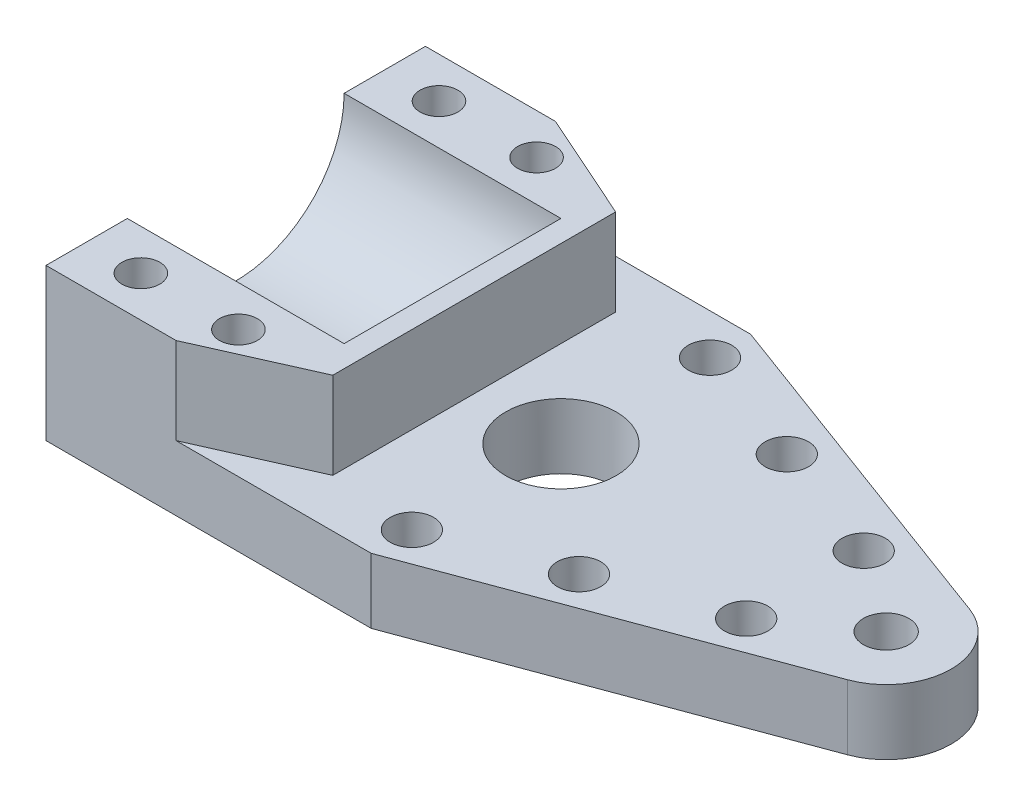
ISO-10303-21;
HEADER;
FILE_DESCRIPTION(('STEP AP214'),'2;1');
FILE_NAME('part.step','',(''),(''),'','','');
FILE_SCHEMA(('AUTOMOTIVE_DESIGN { 1 0 10303 214 1 1 1 1 }'));
ENDSEC;
DATA;
#1=APPLICATION_CONTEXT('core data for automotive mechanical design processes');
#2=APPLICATION_PROTOCOL_DEFINITION('international standard','automotive_design',2000,#1);
#3=PRODUCT_CONTEXT('',#1,'mechanical');
#4=PRODUCT('Part','Part','',(#3));
#5=PRODUCT_RELATED_PRODUCT_CATEGORY('part','',(#4));
#6=PRODUCT_DEFINITION_FORMATION('','',#4);
#7=PRODUCT_DEFINITION_CONTEXT('part definition',#1,'design');
#8=PRODUCT_DEFINITION('design','',#6,#7);
#9=PRODUCT_DEFINITION_SHAPE('','',#8);
#10=(LENGTH_UNIT() NAMED_UNIT(*) SI_UNIT(.MILLI.,.METRE.));
#11=(NAMED_UNIT(*) PLANE_ANGLE_UNIT() SI_UNIT($,.RADIAN.));
#12=(NAMED_UNIT(*) SI_UNIT($,.STERADIAN.) SOLID_ANGLE_UNIT());
#13=UNCERTAINTY_MEASURE_WITH_UNIT(LENGTH_MEASURE(1.E-05),#10,'distance_accuracy_value','');
#14=(GEOMETRIC_REPRESENTATION_CONTEXT(3) GLOBAL_UNCERTAINTY_ASSIGNED_CONTEXT((#13)) GLOBAL_UNIT_ASSIGNED_CONTEXT((#10,
#11,#12)) REPRESENTATION_CONTEXT('',''));
#15=CARTESIAN_POINT('',(0.,0.,0.));
#16=DIRECTION('',(0.,0.,1.));
#17=DIRECTION('',(1.,0.,0.));
#18=AXIS2_PLACEMENT_3D('',#15,#16,#17);
#19=CARTESIAN_POINT('',(30.,-14.,0.));
#20=DIRECTION('',(0.,1.,0.));
#21=DIRECTION('',(0.,0.,1.));
#22=AXIS2_PLACEMENT_3D('',#19,#20,#21);
#23=CYLINDRICAL_SURFACE('',#22,2.09999999999999);
#24=CARTESIAN_POINT('',(30.,-8.,0.));
#25=DIRECTION('',(0.,-1.,0.));
#26=DIRECTION('',(0.,0.,-1.));
#27=AXIS2_PLACEMENT_3D('',#24,#25,#26);
#28=CIRCLE('',#27,2.09999999999999);
#29=CARTESIAN_POINT('',(30.,-8.,-2.1));
#30=VERTEX_POINT('',#29);
#31=EDGE_CURVE('E145',#30,#30,#28,.F.);
#32=ORIENTED_EDGE('',*,*,#31,.T.);
#33=EDGE_LOOP('',(#32));
#34=FACE_BOUND('',#33,.T.);
#35=CARTESIAN_POINT('',(30.,-12.5,0.));
#36=DIRECTION('',(0.,-1.,0.));
#37=DIRECTION('',(0.,0.,-1.));
#38=AXIS2_PLACEMENT_3D('',#35,#36,#37);
#39=CIRCLE('',#38,2.09999999999999);
#40=CARTESIAN_POINT('',(30.,-12.5,-2.1));
#41=VERTEX_POINT('',#40);
#42=EDGE_CURVE('E48',#41,#41,#39,.F.);
#43=ORIENTED_EDGE('',*,*,#42,.F.);
#44=EDGE_LOOP('',(#43));
#45=FACE_BOUND('',#44,.T.);
#46=ADVANCED_FACE('F43',(#34,#45),#23,.F.);
#47=CARTESIAN_POINT('',(-25.,-98.,13.75));
#48=DIRECTION('',(0.,1.,0.));
#49=DIRECTION('',(0.,0.,1.));
#50=AXIS2_PLACEMENT_3D('',#47,#48,#49);
#51=CYLINDRICAL_SURFACE('',#50,1.75);
#52=CARTESIAN_POINT('',(-25.,0.,13.75));
#53=DIRECTION('',(0.,1.,0.));
#54=DIRECTION('',(0.,0.,-1.));
#55=AXIS2_PLACEMENT_3D('',#52,#53,#54);
#56=CIRCLE('',#55,1.75);
#57=CARTESIAN_POINT('',(-25.,0.,12.));
#58=VERTEX_POINT('',#57);
#59=EDGE_CURVE('E235',#58,#58,#56,.T.);
#60=ORIENTED_EDGE('',*,*,#59,.T.);
#61=EDGE_LOOP('',(#60));
#62=FACE_BOUND('',#61,.T.);
#63=CARTESIAN_POINT('',(-25.,-12.5,13.75));
#64=DIRECTION('',(0.,-1.,0.));
#65=DIRECTION('',(0.,0.,-1.));
#66=AXIS2_PLACEMENT_3D('',#63,#64,#65);
#67=CIRCLE('',#66,1.75);
#68=CARTESIAN_POINT('',(-25.,-12.5,12.));
#69=VERTEX_POINT('',#68);
#70=EDGE_CURVE('E198',#69,#69,#67,.F.);
#71=ORIENTED_EDGE('',*,*,#70,.F.);
#72=EDGE_LOOP('',(#71));
#73=FACE_BOUND('',#72,.T.);
#74=ADVANCED_FACE('F343',(#62,#73),#51,.F.);
#75=CARTESIAN_POINT('',(-16.,-98.,13.75));
#76=DIRECTION('',(0.,1.,0.));
#77=DIRECTION('',(0.,0.,1.));
#78=AXIS2_PLACEMENT_3D('',#75,#76,#77);
#79=CYLINDRICAL_SURFACE('',#78,1.75);
#80=CARTESIAN_POINT('',(-16.,0.,13.75));
#81=DIRECTION('',(0.,1.,0.));
#82=DIRECTION('',(0.,0.,-1.));
#83=AXIS2_PLACEMENT_3D('',#80,#81,#82);
#84=CIRCLE('',#83,1.75);
#85=CARTESIAN_POINT('',(-16.,0.,12.));
#86=VERTEX_POINT('',#85);
#87=EDGE_CURVE('E243',#86,#86,#84,.T.);
#88=ORIENTED_EDGE('',*,*,#87,.T.);
#89=EDGE_LOOP('',(#88));
#90=FACE_BOUND('',#89,.T.);
#91=CARTESIAN_POINT('',(-16.,-12.5,13.75));
#92=DIRECTION('',(0.,-1.,0.));
#93=DIRECTION('',(0.,0.,-1.));
#94=AXIS2_PLACEMENT_3D('',#91,#92,#93);
#95=CIRCLE('',#94,1.75);
#96=CARTESIAN_POINT('',(-16.,-12.5,12.));
#97=VERTEX_POINT('',#96);
#98=EDGE_CURVE('E196',#97,#97,#95,.F.);
#99=ORIENTED_EDGE('',*,*,#98,.F.);
#100=EDGE_LOOP('',(#99));
#101=FACE_BOUND('',#100,.T.);
#102=ADVANCED_FACE('F349',(#90,#101),#79,.F.);
#103=CARTESIAN_POINT('',(-16.,-98.,-13.75));
#104=DIRECTION('',(0.,1.,0.));
#105=DIRECTION('',(0.,0.,1.));
#106=AXIS2_PLACEMENT_3D('',#103,#104,#105);
#107=CYLINDRICAL_SURFACE('',#106,1.75);
#108=CARTESIAN_POINT('',(-16.,0.,-13.75));
#109=DIRECTION('',(0.,1.,0.));
#110=DIRECTION('',(0.,0.,1.));
#111=AXIS2_PLACEMENT_3D('',#108,#109,#110);
#112=CIRCLE('',#111,1.75);
#113=CARTESIAN_POINT('',(-16.,0.,-12.));
#114=VERTEX_POINT('',#113);
#115=EDGE_CURVE('E240',#114,#114,#112,.T.);
#116=ORIENTED_EDGE('',*,*,#115,.T.);
#117=EDGE_LOOP('',(#116));
#118=FACE_BOUND('',#117,.T.);
#119=CARTESIAN_POINT('',(-16.,-12.5,-13.75));
#120=DIRECTION('',(0.,-1.,0.));
#121=DIRECTION('',(0.,0.,-1.));
#122=AXIS2_PLACEMENT_3D('',#119,#120,#121);
#123=CIRCLE('',#122,1.75);
#124=CARTESIAN_POINT('',(-16.,-12.5,-15.5));
#125=VERTEX_POINT('',#124);
#126=EDGE_CURVE('E192',#125,#125,#123,.F.);
#127=ORIENTED_EDGE('',*,*,#126,.F.);
#128=EDGE_LOOP('',(#127));
#129=FACE_BOUND('',#128,.T.);
#130=ADVANCED_FACE('F383',(#118,#129),#107,.F.);
#131=CARTESIAN_POINT('',(-25.,-98.,-13.75));
#132=DIRECTION('',(0.,1.,0.));
#133=DIRECTION('',(0.,0.,1.));
#134=AXIS2_PLACEMENT_3D('',#131,#132,#133);
#135=CYLINDRICAL_SURFACE('',#134,1.75);
#136=CARTESIAN_POINT('',(-25.,0.,-13.75));
#137=DIRECTION('',(0.,1.,0.));
#138=DIRECTION('',(0.,0.,1.));
#139=AXIS2_PLACEMENT_3D('',#136,#137,#138);
#140=CIRCLE('',#139,1.75);
#141=CARTESIAN_POINT('',(-25.,0.,-12.));
#142=VERTEX_POINT('',#141);
#143=EDGE_CURVE('E236',#142,#142,#140,.T.);
#144=ORIENTED_EDGE('',*,*,#143,.T.);
#145=EDGE_LOOP('',(#144));
#146=FACE_BOUND('',#145,.T.);
#147=CARTESIAN_POINT('',(-25.,-12.5,-13.75));
#148=DIRECTION('',(0.,-1.,0.));
#149=DIRECTION('',(0.,0.,-1.));
#150=AXIS2_PLACEMENT_3D('',#147,#148,#149);
#151=CIRCLE('',#150,1.75);
#152=CARTESIAN_POINT('',(-25.,-12.5,-15.5));
#153=VERTEX_POINT('',#152);
#154=EDGE_CURVE('E189',#153,#153,#151,.F.);
#155=ORIENTED_EDGE('',*,*,#154,.F.);
#156=EDGE_LOOP('',(#155));
#157=FACE_BOUND('',#156,.T.);
#158=ADVANCED_FACE('F380',(#146,#157),#135,.F.);
#159=CARTESIAN_POINT('',(30.,-14.,0.));
#160=DIRECTION('',(0.,1.,0.));
#161=DIRECTION('',(0.,0.,1.));
#162=AXIS2_PLACEMENT_3D('',#159,#160,#161);
#163=CYLINDRICAL_SURFACE('',#162,6.00000000000001);
#164=CARTESIAN_POINT('',(30.,-8.,0.));
#165=DIRECTION('',(0.,-1.,0.));
#166=DIRECTION('',(0.,0.,-1.));
#167=AXIS2_PLACEMENT_3D('',#164,#165,#166);
#168=CIRCLE('',#167,6.00000000000001);
#169=CARTESIAN_POINT('',(32.0824342229641,-8.,5.62703009650988));
#170=VERTEX_POINT('',#169);
#171=CARTESIAN_POINT('',(32.0824342229641,-8.,-5.62703009650988));
#172=VERTEX_POINT('',#171);
#173=EDGE_CURVE('E140',#170,#172,#168,.F.);
#174=ORIENTED_EDGE('',*,*,#173,.F.);
#175=DIRECTION('',(0.,1.,0.));
#176=VECTOR('',#175,1.);
#177=CARTESIAN_POINT('',(32.0824342229641,-14.,5.62703009650987));
#178=LINE('',#177,#176);
#179=CARTESIAN_POINT('',(32.0824342229641,-14.,5.62703009650987));
#180=VERTEX_POINT('',#179);
#181=EDGE_CURVE('E171',#180,#170,#178,.T.);
#182=ORIENTED_EDGE('',*,*,#181,.F.);
#183=CARTESIAN_POINT('',(30.,-14.,0.));
#184=DIRECTION('',(0.,1.,0.));
#185=DIRECTION('',(0.,0.,1.));
#186=AXIS2_PLACEMENT_3D('',#183,#184,#185);
#187=CIRCLE('',#186,6.00000000000001);
#188=CARTESIAN_POINT('',(32.0824342229641,-14.,-5.62703009650988));
#189=VERTEX_POINT('',#188);
#190=EDGE_CURVE('E282',#180,#189,#187,.T.);
#191=ORIENTED_EDGE('',*,*,#190,.T.);
#192=DIRECTION('',(0.,1.,0.));
#193=VECTOR('',#192,1.);
#194=CARTESIAN_POINT('',(32.0824342229641,-14.,-5.62703009650988));
#195=LINE('',#194,#193);
#196=EDGE_CURVE('E160',#189,#172,#195,.T.);
#197=ORIENTED_EDGE('',*,*,#196,.T.);
#198=EDGE_LOOP('',(#174,#182,#191,#197));
#199=FACE_BOUND('',#198,.T.);
#200=ADVANCED_FACE('F354',(#199),#163,.T.);
#201=CARTESIAN_POINT('',(5.69621113377415,-14.,15.3919634686941));
#202=DIRECTION('',(0.347072370494016,0.,0.937838349418312));
#203=DIRECTION('',(0.937838349418312,0.,-0.347072370494016));
#204=AXIS2_PLACEMENT_3D('',#201,#202,#203);
#205=PLANE('',#204);
#206=DIRECTION('',(0.937838349418312,0.,-0.347072370494016));
#207=VECTOR('',#206,1.);
#208=CARTESIAN_POINT('',(5.69621113377415,-8.,15.3919634686941));
#209=LINE('',#208,#207);
#210=CARTESIAN_POINT('',(0.,-8.,17.5));
#211=VERTEX_POINT('',#210);
#212=EDGE_CURVE('E232',#211,#170,#209,.T.);
#213=ORIENTED_EDGE('',*,*,#212,.F.);
#214=DIRECTION('',(0.,1.,0.));
#215=VECTOR('',#214,1.);
#216=CARTESIAN_POINT('',(0.,-14.,17.5));
#217=LINE('',#216,#215);
#218=CARTESIAN_POINT('',(0.,-14.,17.5));
#219=VERTEX_POINT('',#218);
#220=EDGE_CURVE('E303',#219,#211,#217,.T.);
#221=ORIENTED_EDGE('',*,*,#220,.F.);
#222=DIRECTION('',(0.937838349418313,0.,-0.347072370494016));
#223=VECTOR('',#222,1.);
#224=CARTESIAN_POINT('',(5.69621113377415,-14.,15.3919634686941));
#225=LINE('',#224,#223);
#226=EDGE_CURVE('E296',#219,#180,#225,.T.);
#227=ORIENTED_EDGE('',*,*,#226,.T.);
#228=ORIENTED_EDGE('',*,*,#181,.T.);
#229=EDGE_LOOP('',(#213,#221,#227,#228));
#230=FACE_BOUND('',#229,.T.);
#231=ADVANCED_FACE('F429',(#230),#205,.T.);
#232=CARTESIAN_POINT('',(0.,-14.,17.5));
#233=DIRECTION('',(0.,0.,1.));
#234=DIRECTION('',(1.,0.,0.));
#235=AXIS2_PLACEMENT_3D('',#232,#233,#234);
#236=PLANE('',#235);
#237=DIRECTION('',(1.,0.,0.));
#238=VECTOR('',#237,1.);
#239=CARTESIAN_POINT('',(0.,-8.,17.5));
#240=LINE('',#239,#238);
#241=CARTESIAN_POINT('',(-18.0000000000001,-8.,17.5));
#242=VERTEX_POINT('',#241);
#243=EDGE_CURVE('E61',#242,#211,#240,.T.);
#244=ORIENTED_EDGE('',*,*,#243,.F.);
#245=DIRECTION('',(0.,1.,0.));
#246=VECTOR('',#245,1.);
#247=CARTESIAN_POINT('',(-18.0000000000001,0.,17.5));
#248=LINE('',#247,#246);
#249=CARTESIAN_POINT('',(-18.0000000000001,0.,17.5));
#250=VERTEX_POINT('',#249);
#251=EDGE_CURVE('E65',#242,#250,#248,.T.);
#252=ORIENTED_EDGE('',*,*,#251,.T.);
#253=DIRECTION('',(1.,0.,0.));
#254=VECTOR('',#253,1.);
#255=CARTESIAN_POINT('',(0.,0.,17.5));
#256=LINE('',#255,#254);
#257=CARTESIAN_POINT('',(-30.,0.,17.5));
#258=VERTEX_POINT('',#257);
#259=EDGE_CURVE('E276',#258,#250,#256,.T.);
#260=ORIENTED_EDGE('',*,*,#259,.F.);
#261=DIRECTION('',(0.,1.,0.));
#262=VECTOR('',#261,1.);
#263=CARTESIAN_POINT('',(-30.,-14.,17.5));
#264=LINE('',#263,#262);
#265=CARTESIAN_POINT('',(-30.,-14.,17.5));
#266=VERTEX_POINT('',#265);
#267=EDGE_CURVE('E163',#266,#258,#264,.T.);
#268=ORIENTED_EDGE('',*,*,#267,.F.);
#269=DIRECTION('',(1.,0.,0.));
#270=VECTOR('',#269,1.);
#271=CARTESIAN_POINT('',(0.,-14.,17.5));
#272=LINE('',#271,#270);
#273=EDGE_CURVE('E293',#266,#219,#272,.T.);
#274=ORIENTED_EDGE('',*,*,#273,.T.);
#275=ORIENTED_EDGE('',*,*,#220,.T.);
#276=EDGE_LOOP('',(#244,#252,#260,#268,#274,#275));
#277=FACE_BOUND('',#276,.T.);
#278=ADVANCED_FACE('F312',(#277),#236,.T.);
#279=CARTESIAN_POINT('',(-30.,-14.,0.));
#280=DIRECTION('',(1.,0.,0.));
#281=DIRECTION('',(0.,0.,-1.));
#282=AXIS2_PLACEMENT_3D('',#279,#280,#281);
#283=PLANE('',#282);
#284=ORIENTED_EDGE('',*,*,#267,.T.);
#285=DIRECTION('',(0.,0.,1.));
#286=VECTOR('',#285,1.);
#287=CARTESIAN_POINT('',(-30.,0.,-28.7805717916523));
#288=LINE('',#287,#286);
#289=CARTESIAN_POINT('',(-30.,0.,10.));
#290=VERTEX_POINT('',#289);
#291=EDGE_CURVE('E265',#290,#258,#288,.T.);
#292=ORIENTED_EDGE('',*,*,#291,.F.);
#293=CARTESIAN_POINT('',(-30.,0.,0.));
#294=DIRECTION('',(-1.,0.,0.));
#295=DIRECTION('',(0.,0.,1.));
#296=AXIS2_PLACEMENT_3D('',#293,#294,#295);
#297=CIRCLE('',#296,10.);
#298=CARTESIAN_POINT('',(-30.,0.,-10.));
#299=VERTEX_POINT('',#298);
#300=EDGE_CURVE('E278',#299,#290,#297,.T.);
#301=ORIENTED_EDGE('',*,*,#300,.F.);
#302=CARTESIAN_POINT('',(-30.,0.,-17.5));
#303=VERTEX_POINT('',#302);
#304=EDGE_CURVE('E267',#303,#299,#288,.T.);
#305=ORIENTED_EDGE('',*,*,#304,.F.);
#306=DIRECTION('',(0.,1.,0.));
#307=VECTOR('',#306,1.);
#308=CARTESIAN_POINT('',(-30.,-14.,-17.5));
#309=LINE('',#308,#307);
#310=CARTESIAN_POINT('',(-30.,-14.,-17.5));
#311=VERTEX_POINT('',#310);
#312=EDGE_CURVE('E159',#311,#303,#309,.T.);
#313=ORIENTED_EDGE('',*,*,#312,.F.);
#314=DIRECTION('',(0.,0.,-1.));
#315=VECTOR('',#314,1.);
#316=CARTESIAN_POINT('',(-30.,-14.,0.));
#317=LINE('',#316,#315);
#318=EDGE_CURVE('E290',#266,#311,#317,.T.);
#319=ORIENTED_EDGE('',*,*,#318,.F.);
#320=EDGE_LOOP('',(#284,#292,#301,#305,#313,#319));
#321=FACE_BOUND('',#320,.T.);
#322=ADVANCED_FACE('F308',(#321),#283,.F.);
#323=CARTESIAN_POINT('',(0.,-14.,-17.5));
#324=DIRECTION('',(0.,0.,1.));
#325=DIRECTION('',(1.,0.,0.));
#326=AXIS2_PLACEMENT_3D('',#323,#324,#325);
#327=PLANE('',#326);
#328=DIRECTION('',(1.,0.,0.));
#329=VECTOR('',#328,1.);
#330=CARTESIAN_POINT('',(0.,0.,-17.5));
#331=LINE('',#330,#329);
#332=CARTESIAN_POINT('',(-18.0000000000001,0.,-17.5));
#333=VERTEX_POINT('',#332);
#334=EDGE_CURVE('E274',#303,#333,#331,.T.);
#335=ORIENTED_EDGE('',*,*,#334,.T.);
#336=DIRECTION('',(0.,-1.,0.));
#337=VECTOR('',#336,1.);
#338=CARTESIAN_POINT('',(-18.0000000000001,-14.,-17.5));
#339=LINE('',#338,#337);
#340=CARTESIAN_POINT('',(-18.0000000000001,-8.,-17.5));
#341=VERTEX_POINT('',#340);
#342=EDGE_CURVE('E154',#333,#341,#339,.T.);
#343=ORIENTED_EDGE('',*,*,#342,.T.);
#344=DIRECTION('',(1.,0.,0.));
#345=VECTOR('',#344,1.);
#346=CARTESIAN_POINT('',(0.,-8.,-17.5));
#347=LINE('',#346,#345);
#348=CARTESIAN_POINT('',(0.,-8.,-17.5));
#349=VERTEX_POINT('',#348);
#350=EDGE_CURVE('E137',#341,#349,#347,.T.);
#351=ORIENTED_EDGE('',*,*,#350,.T.);
#352=DIRECTION('',(0.,1.,0.));
#353=VECTOR('',#352,1.);
#354=CARTESIAN_POINT('',(0.,-14.,-17.5));
#355=LINE('',#354,#353);
#356=CARTESIAN_POINT('',(0.,-14.,-17.5));
#357=VERTEX_POINT('',#356);
#358=EDGE_CURVE('E152',#357,#349,#355,.T.);
#359=ORIENTED_EDGE('',*,*,#358,.F.);
#360=DIRECTION('',(1.,0.,0.));
#361=VECTOR('',#360,1.);
#362=CARTESIAN_POINT('',(0.,-14.,-17.5));
#363=LINE('',#362,#361);
#364=EDGE_CURVE('E288',#311,#357,#363,.T.);
#365=ORIENTED_EDGE('',*,*,#364,.F.);
#366=ORIENTED_EDGE('',*,*,#312,.T.);
#367=EDGE_LOOP('',(#335,#343,#351,#359,#365,#366));
#368=FACE_BOUND('',#367,.T.);
#369=ADVANCED_FACE('F151',(#368),#327,.F.);
#370=CARTESIAN_POINT('',(5.69621113377415,-14.,-15.3919634686941));
#371=DIRECTION('',(-0.347072370494016,0.,0.937838349418312));
#372=DIRECTION('',(0.937838349418312,0.,0.347072370494016));
#373=AXIS2_PLACEMENT_3D('',#370,#371,#372);
#374=PLANE('',#373);
#375=ORIENTED_EDGE('',*,*,#358,.T.);
#376=DIRECTION('',(0.937838349418312,0.,0.347072370494016));
#377=VECTOR('',#376,1.);
#378=CARTESIAN_POINT('',(5.69621113377415,-8.,-15.3919634686941));
#379=LINE('',#378,#377);
#380=EDGE_CURVE('E133',#349,#172,#379,.T.);
#381=ORIENTED_EDGE('',*,*,#380,.T.);
#382=ORIENTED_EDGE('',*,*,#196,.F.);
#383=DIRECTION('',(0.937838349418313,0.,0.347072370494016));
#384=VECTOR('',#383,1.);
#385=CARTESIAN_POINT('',(5.69621113377415,-14.,-15.3919634686941));
#386=LINE('',#385,#384);
#387=EDGE_CURVE('E157',#357,#189,#386,.T.);
#388=ORIENTED_EDGE('',*,*,#387,.F.);
#389=EDGE_LOOP('',(#375,#381,#382,#388));
#390=FACE_BOUND('',#389,.T.);
#391=ADVANCED_FACE('F156',(#390),#374,.F.);
#392=CARTESIAN_POINT('',(0.,-14.,0.));
#393=DIRECTION('',(0.,1.,0.));
#394=DIRECTION('',(0.,0.,1.));
#395=AXIS2_PLACEMENT_3D('',#392,#393,#394);
#396=CYLINDRICAL_SURFACE('',#395,5.1);
#397=CARTESIAN_POINT('',(0.,-8.,0.));
#398=DIRECTION('',(0.,-1.,0.));
#399=DIRECTION('',(0.,0.,-1.));
#400=AXIS2_PLACEMENT_3D('',#397,#398,#399);
#401=CIRCLE('',#400,5.1);
#402=CARTESIAN_POINT('',(0.,-8.,-5.1));
#403=VERTEX_POINT('',#402);
#404=EDGE_CURVE('E226',#403,#403,#401,.F.);
#405=ORIENTED_EDGE('',*,*,#404,.T.);
#406=EDGE_LOOP('',(#405));
#407=FACE_BOUND('',#406,.T.);
#408=CARTESIAN_POINT('',(0.,-14.,0.));
#409=DIRECTION('',(0.,1.,0.));
#410=DIRECTION('',(0.,0.,1.));
#411=AXIS2_PLACEMENT_3D('',#408,#409,#410);
#412=CIRCLE('',#411,5.1);
#413=CARTESIAN_POINT('',(0.,-14.,5.1));
#414=VERTEX_POINT('',#413);
#415=EDGE_CURVE('E165',#414,#414,#412,.T.);
#416=ORIENTED_EDGE('',*,*,#415,.F.);
#417=EDGE_LOOP('',(#416));
#418=FACE_BOUND('',#417,.T.);
#419=ADVANCED_FACE('F415',(#407,#418),#396,.F.);
#420=CARTESIAN_POINT('',(0.,-14.,0.));
#421=DIRECTION('',(0.,1.,0.));
#422=DIRECTION('',(0.,0.,1.));
#423=AXIS2_PLACEMENT_3D('',#420,#421,#422);
#424=PLANE('',#423);
#425=CARTESIAN_POINT('',(30.,-14.,0.));
#426=DIRECTION('',(0.,-1.,0.));
#427=DIRECTION('',(0.,0.,-1.));
#428=AXIS2_PLACEMENT_3D('',#425,#426,#427);
#429=CIRCLE('',#428,4.25);
#430=CARTESIAN_POINT('',(30.,-14.,-4.25000000000001));
#431=VERTEX_POINT('',#430);
#432=EDGE_CURVE('E650',#431,#431,#429,.T.);
#433=ORIENTED_EDGE('',*,*,#432,.F.);
#434=EDGE_LOOP('',(#433));
#435=FACE_BOUND('',#434,.T.);
#436=CARTESIAN_POINT('',(-16.,-14.,13.75));
#437=DIRECTION('',(0.,-1.,0.));
#438=DIRECTION('',(0.,0.,-1.));
#439=AXIS2_PLACEMENT_3D('',#436,#437,#438);
#440=CIRCLE('',#439,3.25);
#441=CARTESIAN_POINT('',(-16.,-14.,10.5));
#442=VERTEX_POINT('',#441);
#443=EDGE_CURVE('E640',#442,#442,#440,.T.);
#444=ORIENTED_EDGE('',*,*,#443,.F.);
#445=EDGE_LOOP('',(#444));
#446=FACE_BOUND('',#445,.T.);
#447=CARTESIAN_POINT('',(-25.,-14.,-13.75));
#448=DIRECTION('',(0.,-1.,0.));
#449=DIRECTION('',(0.,0.,-1.));
#450=AXIS2_PLACEMENT_3D('',#447,#448,#449);
#451=CIRCLE('',#450,3.25);
#452=CARTESIAN_POINT('',(-25.,-14.,-17.));
#453=VERTEX_POINT('',#452);
#454=EDGE_CURVE('E633',#453,#453,#451,.T.);
#455=ORIENTED_EDGE('',*,*,#454,.F.);
#456=EDGE_LOOP('',(#455));
#457=FACE_BOUND('',#456,.T.);
#458=CARTESIAN_POINT('',(-16.,-14.,-13.75));
#459=DIRECTION('',(0.,-1.,0.));
#460=DIRECTION('',(0.,0.,-1.));
#461=AXIS2_PLACEMENT_3D('',#458,#459,#460);
#462=CIRCLE('',#461,3.25);
#463=CARTESIAN_POINT('',(-16.,-14.,-17.));
#464=VERTEX_POINT('',#463);
#465=EDGE_CURVE('E645',#464,#464,#462,.T.);
#466=ORIENTED_EDGE('',*,*,#465,.F.);
#467=EDGE_LOOP('',(#466));
#468=FACE_BOUND('',#467,.T.);
#469=CARTESIAN_POINT('',(-25.,-14.,13.75));
#470=DIRECTION('',(0.,-1.,0.));
#471=DIRECTION('',(0.,0.,-1.));
#472=AXIS2_PLACEMENT_3D('',#469,#470,#471);
#473=CIRCLE('',#472,3.25);
#474=CARTESIAN_POINT('',(-25.,-14.,10.5));
#475=VERTEX_POINT('',#474);
#476=EDGE_CURVE('E628',#475,#475,#473,.T.);
#477=ORIENTED_EDGE('',*,*,#476,.F.);
#478=EDGE_LOOP('',(#477));
#479=FACE_BOUND('',#478,.T.);
#480=CARTESIAN_POINT('',(11.2540601930197,-14.,9.58513155407181));
#481=DIRECTION('',(0.,1.,0.));
#482=DIRECTION('',(0.,0.,1.));
#483=AXIS2_PLACEMENT_3D('',#480,#481,#482);
#484=CIRCLE('',#483,2.);
#485=CARTESIAN_POINT('',(11.2540601930197,-14.,11.5851315540718));
#486=VERTEX_POINT('',#485);
#487=EDGE_CURVE('E262',#486,#486,#484,.T.);
#488=ORIENTED_EDGE('',*,*,#487,.T.);
#489=EDGE_LOOP('',(#488));
#490=FACE_BOUND('',#489,.T.);
#491=CARTESIAN_POINT('',(22.5081203860395,-14.,-5.42026310814362));
#492=DIRECTION('',(0.,1.,0.));
#493=DIRECTION('',(0.,0.,1.));
#494=AXIS2_PLACEMENT_3D('',#491,#492,#493);
#495=CIRCLE('',#494,2.);
#496=CARTESIAN_POINT('',(22.5081203860395,-14.,-3.42026310814362));
#497=VERTEX_POINT('',#496);
#498=EDGE_CURVE('E259',#497,#497,#495,.T.);
#499=ORIENTED_EDGE('',*,*,#498,.T.);
#500=EDGE_LOOP('',(#499));
#501=FACE_BOUND('',#500,.T.);
#502=CARTESIAN_POINT('',(11.2540601930198,-14.,-9.58513155407181));
#503=DIRECTION('',(0.,1.,0.));
#504=DIRECTION('',(0.,0.,1.));
#505=AXIS2_PLACEMENT_3D('',#502,#503,#504);
#506=CIRCLE('',#505,2.);
#507=CARTESIAN_POINT('',(11.2540601930198,-14.,-7.58513155407181));
#508=VERTEX_POINT('',#507);
#509=EDGE_CURVE('E256',#508,#508,#506,.T.);
#510=ORIENTED_EDGE('',*,*,#509,.T.);
#511=EDGE_LOOP('',(#510));
#512=FACE_BOUND('',#511,.T.);
#513=CARTESIAN_POINT('',(22.5081203860395,-14.,5.42026310814362));
#514=DIRECTION('',(0.,1.,0.));
#515=DIRECTION('',(0.,0.,1.));
#516=AXIS2_PLACEMENT_3D('',#513,#514,#515);
#517=CIRCLE('',#516,2.);
#518=CARTESIAN_POINT('',(22.5081203860395,-14.,7.42026310814362));
#519=VERTEX_POINT('',#518);
#520=EDGE_CURVE('E253',#519,#519,#517,.T.);
#521=ORIENTED_EDGE('',*,*,#520,.T.);
#522=EDGE_LOOP('',(#521));
#523=FACE_BOUND('',#522,.T.);
#524=CARTESIAN_POINT('',(0.,-14.,13.75));
#525=DIRECTION('',(0.,1.,0.));
#526=DIRECTION('',(0.,0.,1.));
#527=AXIS2_PLACEMENT_3D('',#524,#525,#526);
#528=CIRCLE('',#527,1.99999999999997);
#529=CARTESIAN_POINT('',(0.,-14.,15.75));
#530=VERTEX_POINT('',#529);
#531=EDGE_CURVE('E250',#530,#530,#528,.T.);
#532=ORIENTED_EDGE('',*,*,#531,.T.);
#533=EDGE_LOOP('',(#532));
#534=FACE_BOUND('',#533,.T.);
#535=CARTESIAN_POINT('',(0.,-14.,-13.75));
#536=DIRECTION('',(0.,1.,0.));
#537=DIRECTION('',(0.,0.,1.));
#538=AXIS2_PLACEMENT_3D('',#535,#536,#537);
#539=CIRCLE('',#538,2.);
#540=CARTESIAN_POINT('',(0.,-14.,-11.75));
#541=VERTEX_POINT('',#540);
#542=EDGE_CURVE('E239',#541,#541,#539,.T.);
#543=ORIENTED_EDGE('',*,*,#542,.T.);
#544=EDGE_LOOP('',(#543));
#545=FACE_BOUND('',#544,.T.);
#546=ORIENTED_EDGE('',*,*,#190,.F.);
#547=ORIENTED_EDGE('',*,*,#226,.F.);
#548=ORIENTED_EDGE('',*,*,#273,.F.);
#549=ORIENTED_EDGE('',*,*,#318,.T.);
#550=ORIENTED_EDGE('',*,*,#364,.T.);
#551=ORIENTED_EDGE('',*,*,#387,.T.);
#552=EDGE_LOOP('',(#546,#547,#548,#549,#550,#551));
#553=FACE_BOUND('',#552,.T.);
#554=ORIENTED_EDGE('',*,*,#415,.T.);
#555=EDGE_LOOP('',(#554));
#556=FACE_BOUND('',#555,.T.);
#557=ADVANCED_FACE('F340',(#435,#446,#457,#468,#479,#490,#501,#512,#523,#534,#545,#553,#556),
#424,.F.);
#558=CARTESIAN_POINT('',(-10.,0.,0.));
#559=DIRECTION('',(-1.,0.,0.));
#560=DIRECTION('',(0.,0.,1.));
#561=AXIS2_PLACEMENT_3D('',#558,#559,#560);
#562=CYLINDRICAL_SURFACE('',#561,10.);
#563=ORIENTED_EDGE('',*,*,#300,.T.);
#564=DIRECTION('',(-1.,0.,0.));
#565=VECTOR('',#564,1.);
#566=CARTESIAN_POINT('',(-10.,0.,10.));
#567=LINE('',#566,#565);
#568=CARTESIAN_POINT('',(-10.,0.,10.));
#569=VERTEX_POINT('',#568);
#570=EDGE_CURVE('E271',#290,#569,#567,.F.);
#571=ORIENTED_EDGE('',*,*,#570,.T.);
#572=CARTESIAN_POINT('',(-10.,0.,0.));
#573=DIRECTION('',(-1.,0.,0.));
#574=DIRECTION('',(0.,0.,1.));
#575=AXIS2_PLACEMENT_3D('',#572,#573,#574);
#576=CIRCLE('',#575,10.);
#577=CARTESIAN_POINT('',(-10.,0.,-10.));
#578=VERTEX_POINT('',#577);
#579=EDGE_CURVE('E279',#578,#569,#576,.T.);
#580=ORIENTED_EDGE('',*,*,#579,.F.);
#581=DIRECTION('',(-1.,0.,0.));
#582=VECTOR('',#581,1.);
#583=CARTESIAN_POINT('',(-10.,0.,-10.));
#584=LINE('',#583,#582);
#585=EDGE_CURVE('E268',#578,#299,#584,.T.);
#586=ORIENTED_EDGE('',*,*,#585,.T.);
#587=EDGE_LOOP('',(#563,#571,#580,#586));
#588=FACE_BOUND('',#587,.T.);
#589=ADVANCED_FACE('F328',(#588),#562,.F.);
#590=CARTESIAN_POINT('',(-10.,0.,0.));
#591=DIRECTION('',(-1.,0.,0.));
#592=DIRECTION('',(0.,0.,1.));
#593=AXIS2_PLACEMENT_3D('',#590,#591,#592);
#594=PLANE('',#593);
#595=DIRECTION('',(0.,0.,1.));
#596=VECTOR('',#595,1.);
#597=CARTESIAN_POINT('',(-10.,0.,0.));
#598=LINE('',#597,#596);
#599=EDGE_CURVE('E169',#578,#569,#598,.T.);
#600=ORIENTED_EDGE('',*,*,#599,.F.);
#601=ORIENTED_EDGE('',*,*,#579,.T.);
#602=EDGE_LOOP('',(#600,#601));
#603=FACE_BOUND('',#602,.T.);
#604=ADVANCED_FACE('F330',(#603),#594,.T.);
#605=CARTESIAN_POINT('',(68.,0.,-28.7805717916523));
#606=DIRECTION('',(0.,-1.,0.));
#607=DIRECTION('',(0.,0.,-1.));
#608=AXIS2_PLACEMENT_3D('',#605,#606,#607);
#609=PLANE('',#608);
#610=ORIENTED_EDGE('',*,*,#143,.F.);
#611=EDGE_LOOP('',(#610));
#612=FACE_BOUND('',#611,.T.);
#613=ORIENTED_EDGE('',*,*,#115,.F.);
#614=EDGE_LOOP('',(#613));
#615=FACE_BOUND('',#614,.T.);
#616=ORIENTED_EDGE('',*,*,#87,.F.);
#617=EDGE_LOOP('',(#616));
#618=FACE_BOUND('',#617,.T.);
#619=ORIENTED_EDGE('',*,*,#59,.F.);
#620=EDGE_LOOP('',(#619));
#621=FACE_BOUND('',#620,.T.);
#622=DIRECTION('',(0.,0.,1.));
#623=VECTOR('',#622,1.);
#624=CARTESIAN_POINT('',(-8.,0.,-24.0496752996312));
#625=LINE('',#624,#623);
#626=CARTESIAN_POINT('',(-8.,0.,-13.0477131469146));
#627=VERTEX_POINT('',#626);
#628=CARTESIAN_POINT('',(-8.,0.,13.0477131469146));
#629=VERTEX_POINT('',#628);
#630=EDGE_CURVE('E200',#627,#629,#625,.T.);
#631=ORIENTED_EDGE('',*,*,#630,.F.);
#632=DIRECTION('',(0.913545457642602,0.,0.406736643075798));
#633=VECTOR('',#632,1.);
#634=CARTESIAN_POINT('',(-18.0000000000001,0.,-17.5));
#635=LINE('',#634,#633);
#636=EDGE_CURVE('E185',#627,#333,#635,.F.);
#637=ORIENTED_EDGE('',*,*,#636,.T.);
#638=ORIENTED_EDGE('',*,*,#334,.F.);
#639=ORIENTED_EDGE('',*,*,#304,.T.);
#640=ORIENTED_EDGE('',*,*,#585,.F.);
#641=ORIENTED_EDGE('',*,*,#599,.T.);
#642=ORIENTED_EDGE('',*,*,#570,.F.);
#643=ORIENTED_EDGE('',*,*,#291,.T.);
#644=ORIENTED_EDGE('',*,*,#259,.T.);
#645=DIRECTION('',(0.913545457642602,0.,-0.406736643075798));
#646=VECTOR('',#645,1.);
#647=CARTESIAN_POINT('',(-8.,0.,13.0477131469146));
#648=LINE('',#647,#646);
#649=EDGE_CURVE('E183',#250,#629,#648,.T.);
#650=ORIENTED_EDGE('',*,*,#649,.T.);
#651=EDGE_LOOP('',(#631,#637,#638,#639,#640,#641,#642,#643,#644,#650));
#652=FACE_BOUND('',#651,.T.);
#653=ADVANCED_FACE('F316',(#612,#615,#618,#621,#652),#609,.F.);
#654=CARTESIAN_POINT('',(0.,-98.,-13.75));
#655=DIRECTION('',(0.,1.,0.));
#656=DIRECTION('',(0.,0.,1.));
#657=AXIS2_PLACEMENT_3D('',#654,#655,#656);
#658=CYLINDRICAL_SURFACE('',#657,2.);
#659=CARTESIAN_POINT('',(0.,-8.00000000000001,-13.75));
#660=DIRECTION('',(0.,-1.,0.));
#661=DIRECTION('',(0.,0.,-1.));
#662=AXIS2_PLACEMENT_3D('',#659,#660,#661);
#663=CIRCLE('',#662,2.);
#664=CARTESIAN_POINT('',(0.,-8.00000000000001,-15.75));
#665=VERTEX_POINT('',#664);
#666=EDGE_CURVE('E223',#665,#665,#663,.F.);
#667=ORIENTED_EDGE('',*,*,#666,.T.);
#668=EDGE_LOOP('',(#667));
#669=FACE_BOUND('',#668,.T.);
#670=ORIENTED_EDGE('',*,*,#542,.F.);
#671=EDGE_LOOP('',(#670));
#672=FACE_BOUND('',#671,.T.);
#673=ADVANCED_FACE('F337',(#669,#672),#658,.F.);
#674=CARTESIAN_POINT('',(0.,-98.,13.75));
#675=DIRECTION('',(0.,1.,0.));
#676=DIRECTION('',(0.,0.,1.));
#677=AXIS2_PLACEMENT_3D('',#674,#675,#676);
#678=CYLINDRICAL_SURFACE('',#677,1.99999999999997);
#679=CARTESIAN_POINT('',(0.,-8.00000000000001,13.75));
#680=DIRECTION('',(0.,-1.,0.));
#681=DIRECTION('',(0.,0.,-1.));
#682=AXIS2_PLACEMENT_3D('',#679,#680,#681);
#683=CIRCLE('',#682,1.99999999999997);
#684=CARTESIAN_POINT('',(0.,-8.00000000000001,11.75));
#685=VERTEX_POINT('',#684);
#686=EDGE_CURVE('E220',#685,#685,#683,.F.);
#687=ORIENTED_EDGE('',*,*,#686,.T.);
#688=EDGE_LOOP('',(#687));
#689=FACE_BOUND('',#688,.T.);
#690=ORIENTED_EDGE('',*,*,#531,.F.);
#691=EDGE_LOOP('',(#690));
#692=FACE_BOUND('',#691,.T.);
#693=ADVANCED_FACE('F375',(#689,#692),#678,.F.);
#694=CARTESIAN_POINT('',(22.5081203860395,-98.,5.42026310814362));
#695=DIRECTION('',(0.,1.,0.));
#696=DIRECTION('',(0.,0.,1.));
#697=AXIS2_PLACEMENT_3D('',#694,#695,#696);
#698=CYLINDRICAL_SURFACE('',#697,2.);
#699=CARTESIAN_POINT('',(22.5081203860395,-8.00000000000001,5.42026310814362));
#700=DIRECTION('',(0.,-1.,0.));
#701=DIRECTION('',(0.,0.,-1.));
#702=AXIS2_PLACEMENT_3D('',#699,#700,#701);
#703=CIRCLE('',#702,2.);
#704=CARTESIAN_POINT('',(22.5081203860395,-8.00000000000001,3.42026310814362));
#705=VERTEX_POINT('',#704);
#706=EDGE_CURVE('E217',#705,#705,#703,.F.);
#707=ORIENTED_EDGE('',*,*,#706,.T.);
#708=EDGE_LOOP('',(#707));
#709=FACE_BOUND('',#708,.T.);
#710=ORIENTED_EDGE('',*,*,#520,.F.);
#711=EDGE_LOOP('',(#710));
#712=FACE_BOUND('',#711,.T.);
#713=ADVANCED_FACE('F378',(#709,#712),#698,.F.);
#714=CARTESIAN_POINT('',(11.2540601930198,-98.,-9.58513155407181));
#715=DIRECTION('',(0.,1.,0.));
#716=DIRECTION('',(0.,0.,1.));
#717=AXIS2_PLACEMENT_3D('',#714,#715,#716);
#718=CYLINDRICAL_SURFACE('',#717,2.);
#719=CARTESIAN_POINT('',(11.2540601930198,-8.00000000000001,-9.58513155407181));
#720=DIRECTION('',(0.,-1.,0.));
#721=DIRECTION('',(0.,0.,-1.));
#722=AXIS2_PLACEMENT_3D('',#719,#720,#721);
#723=CIRCLE('',#722,2.);
#724=CARTESIAN_POINT('',(11.2540601930198,-8.00000000000001,-11.5851315540718));
#725=VERTEX_POINT('',#724);
#726=EDGE_CURVE('E214',#725,#725,#723,.F.);
#727=ORIENTED_EDGE('',*,*,#726,.T.);
#728=EDGE_LOOP('',(#727));
#729=FACE_BOUND('',#728,.T.);
#730=ORIENTED_EDGE('',*,*,#509,.F.);
#731=EDGE_LOOP('',(#730));
#732=FACE_BOUND('',#731,.T.);
#733=ADVANCED_FACE('F394',(#729,#732),#718,.F.);
#734=CARTESIAN_POINT('',(22.5081203860395,-98.,-5.42026310814362));
#735=DIRECTION('',(0.,1.,0.));
#736=DIRECTION('',(0.,0.,1.));
#737=AXIS2_PLACEMENT_3D('',#734,#735,#736);
#738=CYLINDRICAL_SURFACE('',#737,2.);
#739=CARTESIAN_POINT('',(22.5081203860395,-8.00000000000001,-5.42026310814362));
#740=DIRECTION('',(0.,-1.,0.));
#741=DIRECTION('',(0.,0.,-1.));
#742=AXIS2_PLACEMENT_3D('',#739,#740,#741);
#743=CIRCLE('',#742,2.);
#744=CARTESIAN_POINT('',(22.5081203860395,-8.00000000000001,-7.42026310814362));
#745=VERTEX_POINT('',#744);
#746=EDGE_CURVE('E175',#745,#745,#743,.F.);
#747=ORIENTED_EDGE('',*,*,#746,.T.);
#748=EDGE_LOOP('',(#747));
#749=FACE_BOUND('',#748,.T.);
#750=ORIENTED_EDGE('',*,*,#498,.F.);
#751=EDGE_LOOP('',(#750));
#752=FACE_BOUND('',#751,.T.);
#753=ADVANCED_FACE('F391',(#749,#752),#738,.F.);
#754=CARTESIAN_POINT('',(11.2540601930197,-98.,9.58513155407181));
#755=DIRECTION('',(0.,1.,0.));
#756=DIRECTION('',(0.,0.,1.));
#757=AXIS2_PLACEMENT_3D('',#754,#755,#756);
#758=CYLINDRICAL_SURFACE('',#757,2.);
#759=CARTESIAN_POINT('',(11.2540601930197,-8.00000000000001,9.58513155407181));
#760=DIRECTION('',(0.,-1.,0.));
#761=DIRECTION('',(0.,0.,-1.));
#762=AXIS2_PLACEMENT_3D('',#759,#760,#761);
#763=CIRCLE('',#762,2.);
#764=CARTESIAN_POINT('',(11.2540601930197,-8.00000000000001,7.58513155407181));
#765=VERTEX_POINT('',#764);
#766=EDGE_CURVE('E172',#765,#765,#763,.F.);
#767=ORIENTED_EDGE('',*,*,#766,.T.);
#768=EDGE_LOOP('',(#767));
#769=FACE_BOUND('',#768,.T.);
#770=ORIENTED_EDGE('',*,*,#487,.F.);
#771=EDGE_LOOP('',(#770));
#772=FACE_BOUND('',#771,.T.);
#773=ADVANCED_FACE('F369',(#769,#772),#758,.F.);
#774=CARTESIAN_POINT('',(-8.,-8.,-24.0496752996312));
#775=DIRECTION('',(-1.,0.,0.));
#776=DIRECTION('',(0.,0.,1.));
#777=AXIS2_PLACEMENT_3D('',#774,#775,#776);
#778=PLANE('',#777);
#779=DIRECTION('',(0.,0.,1.));
#780=VECTOR('',#779,1.);
#781=CARTESIAN_POINT('',(-8.,-8.,-24.0496752996312));
#782=LINE('',#781,#780);
#783=CARTESIAN_POINT('',(-8.,-8.,-13.0477131469146));
#784=VERTEX_POINT('',#783);
#785=CARTESIAN_POINT('',(-8.,-8.,13.0477131469146));
#786=VERTEX_POINT('',#785);
#787=EDGE_CURVE('E176',#784,#786,#782,.T.);
#788=ORIENTED_EDGE('',*,*,#787,.F.);
#789=DIRECTION('',(0.,1.,0.));
#790=VECTOR('',#789,1.);
#791=CARTESIAN_POINT('',(-8.,-8.,-13.0477131469146));
#792=LINE('',#791,#790);
#793=EDGE_CURVE('E181',#784,#627,#792,.T.);
#794=ORIENTED_EDGE('',*,*,#793,.T.);
#795=ORIENTED_EDGE('',*,*,#630,.T.);
#796=DIRECTION('',(0.,-1.,0.));
#797=VECTOR('',#796,1.);
#798=CARTESIAN_POINT('',(-8.,-8.,13.0477131469146));
#799=LINE('',#798,#797);
#800=EDGE_CURVE('E178',#629,#786,#799,.T.);
#801=ORIENTED_EDGE('',*,*,#800,.T.);
#802=EDGE_LOOP('',(#788,#794,#795,#801));
#803=FACE_BOUND('',#802,.T.);
#804=ADVANCED_FACE('F319',(#803),#778,.F.);
#805=CARTESIAN_POINT('',(0.,-8.,0.));
#806=DIRECTION('',(0.,-1.,0.));
#807=DIRECTION('',(0.,0.,-1.));
#808=AXIS2_PLACEMENT_3D('',#805,#806,#807);
#809=PLANE('',#808);
#810=ORIENTED_EDGE('',*,*,#243,.T.);
#811=ORIENTED_EDGE('',*,*,#212,.T.);
#812=ORIENTED_EDGE('',*,*,#173,.T.);
#813=ORIENTED_EDGE('',*,*,#380,.F.);
#814=ORIENTED_EDGE('',*,*,#350,.F.);
#815=DIRECTION('',(-0.913545457642602,0.,-0.406736643075798));
#816=VECTOR('',#815,1.);
#817=CARTESIAN_POINT('',(3.52469268015692,-8.,-7.91658937634349));
#818=LINE('',#817,#816);
#819=EDGE_CURVE('E53',#341,#784,#818,.F.);
#820=ORIENTED_EDGE('',*,*,#819,.T.);
#821=ORIENTED_EDGE('',*,*,#787,.T.);
#822=DIRECTION('',(-0.913545457642602,0.,0.406736643075798));
#823=VECTOR('',#822,1.);
#824=CARTESIAN_POINT('',(3.52469268015691,-8.,7.91658937634349));
#825=LINE('',#824,#823);
#826=EDGE_CURVE('E11',#786,#242,#825,.T.);
#827=ORIENTED_EDGE('',*,*,#826,.T.);
#828=EDGE_LOOP('',(#810,#811,#812,#813,#814,#820,#821,#827));
#829=FACE_BOUND('',#828,.T.);
#830=ORIENTED_EDGE('',*,*,#404,.F.);
#831=EDGE_LOOP('',(#830));
#832=FACE_BOUND('',#831,.T.);
#833=ORIENTED_EDGE('',*,*,#686,.F.);
#834=EDGE_LOOP('',(#833));
#835=FACE_BOUND('',#834,.T.);
#836=ORIENTED_EDGE('',*,*,#726,.F.);
#837=EDGE_LOOP('',(#836));
#838=FACE_BOUND('',#837,.T.);
#839=ORIENTED_EDGE('',*,*,#766,.F.);
#840=EDGE_LOOP('',(#839));
#841=FACE_BOUND('',#840,.T.);
#842=ORIENTED_EDGE('',*,*,#746,.F.);
#843=EDGE_LOOP('',(#842));
#844=FACE_BOUND('',#843,.T.);
#845=ORIENTED_EDGE('',*,*,#706,.F.);
#846=EDGE_LOOP('',(#845));
#847=FACE_BOUND('',#846,.T.);
#848=ORIENTED_EDGE('',*,*,#666,.F.);
#849=EDGE_LOOP('',(#848));
#850=FACE_BOUND('',#849,.T.);
#851=ORIENTED_EDGE('',*,*,#31,.F.);
#852=EDGE_LOOP('',(#851));
#853=FACE_BOUND('',#852,.T.);
#854=ADVANCED_FACE('F135',(#829,#832,#835,#838,#841,#844,#847,#850,#853),#809,.F.);
#855=CARTESIAN_POINT('',(-18.0000000000001,-14.,-17.5));
#856=DIRECTION('',(-0.406736643075798,0.,0.913545457642602));
#857=DIRECTION('',(0.,-1.,0.));
#858=AXIS2_PLACEMENT_3D('',#855,#856,#857);
#859=PLANE('',#858);
#860=ORIENTED_EDGE('',*,*,#636,.F.);
#861=ORIENTED_EDGE('',*,*,#793,.F.);
#862=ORIENTED_EDGE('',*,*,#819,.F.);
#863=ORIENTED_EDGE('',*,*,#342,.F.);
#864=EDGE_LOOP('',(#860,#861,#862,#863));
#865=FACE_BOUND('',#864,.T.);
#866=ADVANCED_FACE('F323',(#865),#859,.F.);
#867=CARTESIAN_POINT('',(-8.,-8.,13.0477131469146));
#868=DIRECTION('',(0.406736643075798,0.,0.913545457642602));
#869=DIRECTION('',(0.,1.,0.));
#870=AXIS2_PLACEMENT_3D('',#867,#868,#869);
#871=PLANE('',#870);
#872=ORIENTED_EDGE('',*,*,#649,.F.);
#873=ORIENTED_EDGE('',*,*,#251,.F.);
#874=ORIENTED_EDGE('',*,*,#826,.F.);
#875=ORIENTED_EDGE('',*,*,#800,.F.);
#876=EDGE_LOOP('',(#872,#873,#874,#875));
#877=FACE_BOUND('',#876,.T.);
#878=ADVANCED_FACE('F46',(#877),#871,.T.);
#879=CARTESIAN_POINT('',(-25.,-12.5,-13.75));
#880=DIRECTION('',(0.,-1.,0.));
#881=DIRECTION('',(0.,0.,-1.));
#882=AXIS2_PLACEMENT_3D('',#879,#880,#881);
#883=PLANE('',#882);
#884=CARTESIAN_POINT('',(-25.,-12.5,-13.75));
#885=DIRECTION('',(0.,-1.,0.));
#886=DIRECTION('',(0.,0.,-1.));
#887=AXIS2_PLACEMENT_3D('',#884,#885,#886);
#888=CIRCLE('',#887,3.25);
#889=CARTESIAN_POINT('',(-25.,-12.5,-17.));
#890=VERTEX_POINT('',#889);
#891=EDGE_CURVE('E636',#890,#890,#888,.T.);
#892=ORIENTED_EDGE('',*,*,#891,.T.);
#893=EDGE_LOOP('',(#892));
#894=FACE_BOUND('',#893,.T.);
#895=ORIENTED_EDGE('',*,*,#154,.T.);
#896=EDGE_LOOP('',(#895));
#897=FACE_BOUND('',#896,.T.);
#898=ADVANCED_FACE('F364',(#894,#897),#883,.T.);
#899=CARTESIAN_POINT('',(-25.,-12.5,-13.75));
#900=DIRECTION('',(0.,-1.,0.));
#901=DIRECTION('',(0.,0.,-1.));
#902=AXIS2_PLACEMENT_3D('',#899,#900,#901);
#903=CYLINDRICAL_SURFACE('',#902,3.25);
#904=ORIENTED_EDGE('',*,*,#891,.F.);
#905=EDGE_LOOP('',(#904));
#906=FACE_BOUND('',#905,.T.);
#907=ORIENTED_EDGE('',*,*,#454,.T.);
#908=EDGE_LOOP('',(#907));
#909=FACE_BOUND('',#908,.T.);
#910=ADVANCED_FACE('F603',(#906,#909),#903,.F.);
#911=CARTESIAN_POINT('',(-16.,-12.5,-13.75));
#912=DIRECTION('',(0.,-1.,0.));
#913=DIRECTION('',(0.,0.,-1.));
#914=AXIS2_PLACEMENT_3D('',#911,#912,#913);
#915=PLANE('',#914);
#916=CARTESIAN_POINT('',(-16.,-12.5,-13.75));
#917=DIRECTION('',(0.,-1.,0.));
#918=DIRECTION('',(0.,0.,-1.));
#919=AXIS2_PLACEMENT_3D('',#916,#917,#918);
#920=CIRCLE('',#919,3.25);
#921=CARTESIAN_POINT('',(-16.,-12.5,-17.));
#922=VERTEX_POINT('',#921);
#923=EDGE_CURVE('E637',#922,#922,#920,.T.);
#924=ORIENTED_EDGE('',*,*,#923,.T.);
#925=EDGE_LOOP('',(#924));
#926=FACE_BOUND('',#925,.T.);
#927=ORIENTED_EDGE('',*,*,#126,.T.);
#928=EDGE_LOOP('',(#927));
#929=FACE_BOUND('',#928,.T.);
#930=ADVANCED_FACE('F599',(#926,#929),#915,.T.);
#931=CARTESIAN_POINT('',(-16.,-12.5,-13.75));
#932=DIRECTION('',(0.,-1.,0.));
#933=DIRECTION('',(0.,0.,-1.));
#934=AXIS2_PLACEMENT_3D('',#931,#932,#933);
#935=CYLINDRICAL_SURFACE('',#934,3.25);
#936=ORIENTED_EDGE('',*,*,#923,.F.);
#937=EDGE_LOOP('',(#936));
#938=FACE_BOUND('',#937,.T.);
#939=ORIENTED_EDGE('',*,*,#465,.T.);
#940=EDGE_LOOP('',(#939));
#941=FACE_BOUND('',#940,.T.);
#942=ADVANCED_FACE('F602',(#938,#941),#935,.F.);
#943=CARTESIAN_POINT('',(-16.,-12.5,13.75));
#944=DIRECTION('',(0.,-1.,0.));
#945=DIRECTION('',(0.,0.,-1.));
#946=AXIS2_PLACEMENT_3D('',#943,#944,#945);
#947=PLANE('',#946);
#948=CARTESIAN_POINT('',(-16.,-12.5,13.75));
#949=DIRECTION('',(0.,-1.,0.));
#950=DIRECTION('',(0.,0.,-1.));
#951=AXIS2_PLACEMENT_3D('',#948,#949,#950);
#952=CIRCLE('',#951,3.25);
#953=CARTESIAN_POINT('',(-16.,-12.5,10.5));
#954=VERTEX_POINT('',#953);
#955=EDGE_CURVE('E631',#954,#954,#952,.T.);
#956=ORIENTED_EDGE('',*,*,#955,.T.);
#957=EDGE_LOOP('',(#956));
#958=FACE_BOUND('',#957,.T.);
#959=ORIENTED_EDGE('',*,*,#98,.T.);
#960=EDGE_LOOP('',(#959));
#961=FACE_BOUND('',#960,.T.);
#962=ADVANCED_FACE('F607',(#958,#961),#947,.T.);
#963=CARTESIAN_POINT('',(-16.,-12.5,13.75));
#964=DIRECTION('',(0.,-1.,0.));
#965=DIRECTION('',(0.,0.,-1.));
#966=AXIS2_PLACEMENT_3D('',#963,#964,#965);
#967=CYLINDRICAL_SURFACE('',#966,3.25);
#968=ORIENTED_EDGE('',*,*,#955,.F.);
#969=EDGE_LOOP('',(#968));
#970=FACE_BOUND('',#969,.T.);
#971=ORIENTED_EDGE('',*,*,#443,.T.);
#972=EDGE_LOOP('',(#971));
#973=FACE_BOUND('',#972,.T.);
#974=ADVANCED_FACE('F611',(#970,#973),#967,.F.);
#975=CARTESIAN_POINT('',(-25.,-12.5,13.75));
#976=DIRECTION('',(0.,-1.,0.));
#977=DIRECTION('',(0.,0.,-1.));
#978=AXIS2_PLACEMENT_3D('',#975,#976,#977);
#979=PLANE('',#978);
#980=CARTESIAN_POINT('',(-25.,-12.5,13.75));
#981=DIRECTION('',(0.,-1.,0.));
#982=DIRECTION('',(0.,0.,-1.));
#983=AXIS2_PLACEMENT_3D('',#980,#981,#982);
#984=CIRCLE('',#983,3.25);
#985=CARTESIAN_POINT('',(-25.,-12.5,10.5));
#986=VERTEX_POINT('',#985);
#987=EDGE_CURVE('E193',#986,#986,#984,.T.);
#988=ORIENTED_EDGE('',*,*,#987,.T.);
#989=EDGE_LOOP('',(#988));
#990=FACE_BOUND('',#989,.T.);
#991=ORIENTED_EDGE('',*,*,#70,.T.);
#992=EDGE_LOOP('',(#991));
#993=FACE_BOUND('',#992,.T.);
#994=ADVANCED_FACE('F615',(#990,#993),#979,.T.);
#995=CARTESIAN_POINT('',(-25.,-12.5,13.75));
#996=DIRECTION('',(0.,-1.,0.));
#997=DIRECTION('',(0.,0.,-1.));
#998=AXIS2_PLACEMENT_3D('',#995,#996,#997);
#999=CYLINDRICAL_SURFACE('',#998,3.25);
#1000=ORIENTED_EDGE('',*,*,#987,.F.);
#1001=EDGE_LOOP('',(#1000));
#1002=FACE_BOUND('',#1001,.T.);
#1003=ORIENTED_EDGE('',*,*,#476,.T.);
#1004=EDGE_LOOP('',(#1003));
#1005=FACE_BOUND('',#1004,.T.);
#1006=ADVANCED_FACE('F372',(#1002,#1005),#999,.F.);
#1007=CARTESIAN_POINT('',(30.,-12.5,0.));
#1008=DIRECTION('',(0.,-1.,0.));
#1009=DIRECTION('',(0.,0.,-1.));
#1010=AXIS2_PLACEMENT_3D('',#1007,#1008,#1009);
#1011=PLANE('',#1010);
#1012=CARTESIAN_POINT('',(30.,-12.5,0.));
#1013=DIRECTION('',(0.,-1.,0.));
#1014=DIRECTION('',(0.,0.,-1.));
#1015=AXIS2_PLACEMENT_3D('',#1012,#1013,#1014);
#1016=CIRCLE('',#1015,4.25);
#1017=CARTESIAN_POINT('',(30.,-12.5,-4.25000000000001));
#1018=VERTEX_POINT('',#1017);
#1019=EDGE_CURVE('E653',#1018,#1018,#1016,.T.);
#1020=ORIENTED_EDGE('',*,*,#1019,.T.);
#1021=EDGE_LOOP('',(#1020));
#1022=FACE_BOUND('',#1021,.T.);
#1023=ORIENTED_EDGE('',*,*,#42,.T.);
#1024=EDGE_LOOP('',(#1023));
#1025=FACE_BOUND('',#1024,.T.);
#1026=ADVANCED_FACE('F576',(#1022,#1025),#1011,.T.);
#1027=CARTESIAN_POINT('',(30.,-12.5,0.));
#1028=DIRECTION('',(0.,-1.,0.));
#1029=DIRECTION('',(0.,0.,-1.));
#1030=AXIS2_PLACEMENT_3D('',#1027,#1028,#1029);
#1031=CYLINDRICAL_SURFACE('',#1030,4.25);
#1032=ORIENTED_EDGE('',*,*,#1019,.F.);
#1033=EDGE_LOOP('',(#1032));
#1034=FACE_BOUND('',#1033,.T.);
#1035=ORIENTED_EDGE('',*,*,#432,.T.);
#1036=EDGE_LOOP('',(#1035));
#1037=FACE_BOUND('',#1036,.T.);
#1038=ADVANCED_FACE('F581',(#1034,#1037),#1031,.F.);
#1039=CLOSED_SHELL('',(#46,#74,#102,#130,#158,#200,#231,#278,#322,#369,#391,#419,#557,#589,#604,
#653,#673,#693,#713,#733,#753,#773,#804,#854,#866,#878,#898,#910,#930,#942,#962,#974,#994,#1006,
#1026,#1038));
#1040=MANIFOLD_SOLID_BREP('B2',#1039);
#1041=ADVANCED_BREP_SHAPE_REPRESENTATION('',(#18,#1040),#14);
#1042=SHAPE_DEFINITION_REPRESENTATION(#9,#1041);
ENDSEC;
END-ISO-10303-21;
